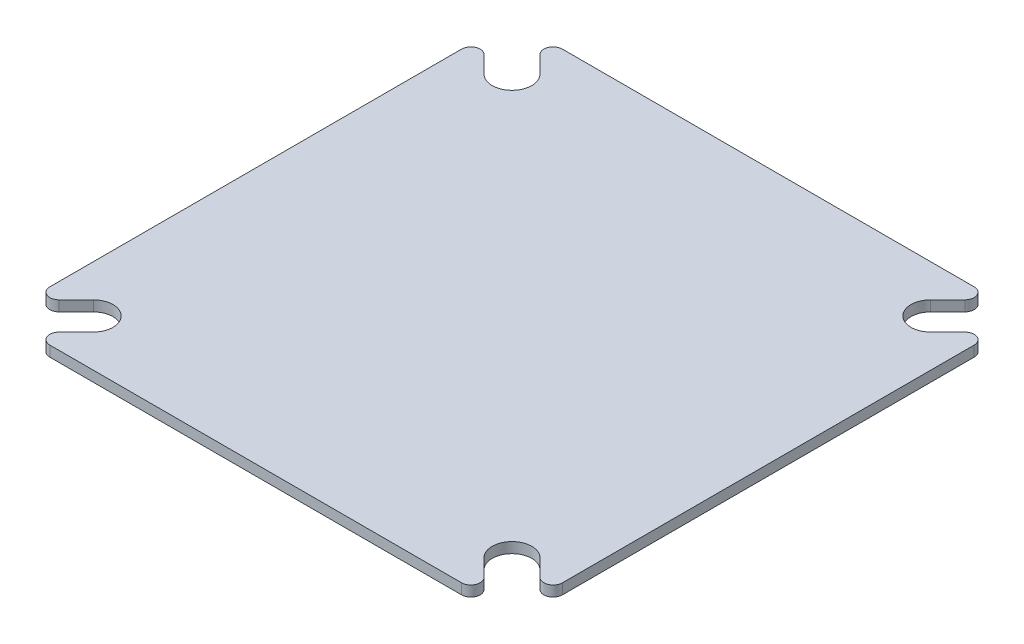
ISO-10303-21;
HEADER;
FILE_DESCRIPTION(('STEP AP214'),'2;1');
FILE_NAME('part.step','',(''),(''),'','','');
FILE_SCHEMA(('AUTOMOTIVE_DESIGN { 1 0 10303 214 1 1 1 1 }'));
ENDSEC;
DATA;
#1=APPLICATION_CONTEXT('core data for automotive mechanical design processes');
#2=APPLICATION_PROTOCOL_DEFINITION('international standard','automotive_design',2000,#1);
#3=PRODUCT_CONTEXT('',#1,'mechanical');
#4=PRODUCT('Part','Part','',(#3));
#5=PRODUCT_RELATED_PRODUCT_CATEGORY('part','',(#4));
#6=PRODUCT_DEFINITION_FORMATION('','',#4);
#7=PRODUCT_DEFINITION_CONTEXT('part definition',#1,'design');
#8=PRODUCT_DEFINITION('design','',#6,#7);
#9=PRODUCT_DEFINITION_SHAPE('','',#8);
#10=(LENGTH_UNIT() NAMED_UNIT(*) SI_UNIT(.MILLI.,.METRE.));
#11=(NAMED_UNIT(*) PLANE_ANGLE_UNIT() SI_UNIT($,.RADIAN.));
#12=(NAMED_UNIT(*) SI_UNIT($,.STERADIAN.) SOLID_ANGLE_UNIT());
#13=UNCERTAINTY_MEASURE_WITH_UNIT(LENGTH_MEASURE(1.E-05),#10,'distance_accuracy_value','');
#14=(GEOMETRIC_REPRESENTATION_CONTEXT(3) GLOBAL_UNCERTAINTY_ASSIGNED_CONTEXT((#13)) GLOBAL_UNIT_ASSIGNED_CONTEXT((#10,
#11,#12)) REPRESENTATION_CONTEXT('',''));
#15=CARTESIAN_POINT('',(0.,0.,0.));
#16=DIRECTION('',(0.,0.,1.));
#17=DIRECTION('',(1.,0.,0.));
#18=AXIS2_PLACEMENT_3D('',#15,#16,#17);
#19=CARTESIAN_POINT('',(-139.7,5.715,139.7));
#20=DIRECTION('',(1.,0.,0.));
#21=DIRECTION('',(0.,0.,-1.));
#22=AXIS2_PLACEMENT_3D('',#19,#20,#21);
#23=PLANE('',#22);
#24=DIRECTION('',(0.,0.,1.));
#25=VECTOR('',#24,1.);
#26=CARTESIAN_POINT('',(-139.7,0.,139.7));
#27=LINE('',#26,#25);
#28=CARTESIAN_POINT('',(-139.7,0.,-112.195795103145));
#29=VERTEX_POINT('',#28);
#30=CARTESIAN_POINT('',(-139.7,0.,112.195795103145));
#31=VERTEX_POINT('',#30);
#32=EDGE_CURVE('E291',#29,#31,#27,.T.);
#33=ORIENTED_EDGE('',*,*,#32,.T.);
#34=DIRECTION('',(0.,1.,0.));
#35=VECTOR('',#34,1.);
#36=CARTESIAN_POINT('',(-139.7,5.715,112.195795103145));
#37=LINE('',#36,#35);
#38=CARTESIAN_POINT('',(-139.7,5.715,112.195795103145));
#39=VERTEX_POINT('',#38);
#40=EDGE_CURVE('E368',#31,#39,#37,.T.);
#41=ORIENTED_EDGE('',*,*,#40,.T.);
#42=DIRECTION('',(0.,0.,1.));
#43=VECTOR('',#42,1.);
#44=CARTESIAN_POINT('',(-139.7,5.715,139.7));
#45=LINE('',#44,#43);
#46=CARTESIAN_POINT('',(-139.7,5.715,-112.195795103145));
#47=VERTEX_POINT('',#46);
#48=EDGE_CURVE('E294',#47,#39,#45,.T.);
#49=ORIENTED_EDGE('',*,*,#48,.F.);
#50=DIRECTION('',(0.,1.,0.));
#51=VECTOR('',#50,1.);
#52=CARTESIAN_POINT('',(-139.7,5.715,-112.195795103145));
#53=LINE('',#52,#51);
#54=EDGE_CURVE('E366',#47,#29,#53,.F.);
#55=ORIENTED_EDGE('',*,*,#54,.T.);
#56=EDGE_LOOP('',(#33,#41,#49,#55));
#57=FACE_BOUND('',#56,.T.);
#58=ADVANCED_FACE('F37',(#57),#23,.F.);
#59=CARTESIAN_POINT('',(139.7,5.715,139.7));
#60=DIRECTION('',(0.,0.,-1.));
#61=DIRECTION('',(-1.,0.,0.));
#62=AXIS2_PLACEMENT_3D('',#59,#60,#61);
#63=PLANE('',#62);
#64=DIRECTION('',(1.,0.,0.));
#65=VECTOR('',#64,1.);
#66=CARTESIAN_POINT('',(139.7,0.,139.7));
#67=LINE('',#66,#65);
#68=CARTESIAN_POINT('',(-112.195795103145,0.,139.7));
#69=VERTEX_POINT('',#68);
#70=CARTESIAN_POINT('',(112.195795103145,0.,139.7));
#71=VERTEX_POINT('',#70);
#72=EDGE_CURVE('E310',#69,#71,#67,.T.);
#73=ORIENTED_EDGE('',*,*,#72,.T.);
#74=DIRECTION('',(0.,1.,0.));
#75=VECTOR('',#74,1.);
#76=CARTESIAN_POINT('',(112.195795103145,5.715,139.7));
#77=LINE('',#76,#75);
#78=CARTESIAN_POINT('',(112.195795103145,5.715,139.7));
#79=VERTEX_POINT('',#78);
#80=EDGE_CURVE('E319',#71,#79,#77,.T.);
#81=ORIENTED_EDGE('',*,*,#80,.T.);
#82=DIRECTION('',(1.,0.,0.));
#83=VECTOR('',#82,1.);
#84=CARTESIAN_POINT('',(139.7,5.715,139.7));
#85=LINE('',#84,#83);
#86=CARTESIAN_POINT('',(-112.195795103145,5.715,139.7));
#87=VERTEX_POINT('',#86);
#88=EDGE_CURVE('E297',#87,#79,#85,.T.);
#89=ORIENTED_EDGE('',*,*,#88,.F.);
#90=DIRECTION('',(0.,1.,0.));
#91=VECTOR('',#90,1.);
#92=CARTESIAN_POINT('',(-112.195795103145,5.715,139.7));
#93=LINE('',#92,#91);
#94=EDGE_CURVE('E307',#87,#69,#93,.F.);
#95=ORIENTED_EDGE('',*,*,#94,.T.);
#96=EDGE_LOOP('',(#73,#81,#89,#95));
#97=FACE_BOUND('',#96,.T.);
#98=ADVANCED_FACE('F454',(#97),#63,.F.);
#99=CARTESIAN_POINT('',(139.7,5.715,139.7));
#100=DIRECTION('',(-1.,0.,0.));
#101=DIRECTION('',(0.,0.,1.));
#102=AXIS2_PLACEMENT_3D('',#99,#100,#101);
#103=PLANE('',#102);
#104=DIRECTION('',(0.,0.,-1.));
#105=VECTOR('',#104,1.);
#106=CARTESIAN_POINT('',(139.7,5.715,139.7));
#107=LINE('',#106,#105);
#108=CARTESIAN_POINT('',(139.7,5.715,112.195795103145));
#109=VERTEX_POINT('',#108);
#110=CARTESIAN_POINT('',(139.7,5.715,-112.195795103145));
#111=VERTEX_POINT('',#110);
#112=EDGE_CURVE('E301',#109,#111,#107,.T.);
#113=ORIENTED_EDGE('',*,*,#112,.F.);
#114=DIRECTION('',(0.,1.,0.));
#115=VECTOR('',#114,1.);
#116=CARTESIAN_POINT('',(139.7,5.715,112.195795103145));
#117=LINE('',#116,#115);
#118=CARTESIAN_POINT('',(139.7,0.,112.195795103145));
#119=VERTEX_POINT('',#118);
#120=EDGE_CURVE('E361',#109,#119,#117,.F.);
#121=ORIENTED_EDGE('',*,*,#120,.T.);
#122=DIRECTION('',(0.,0.,-1.));
#123=VECTOR('',#122,1.);
#124=CARTESIAN_POINT('',(139.7,0.,139.7));
#125=LINE('',#124,#123);
#126=CARTESIAN_POINT('',(139.7,0.,-112.195795103145));
#127=VERTEX_POINT('',#126);
#128=EDGE_CURVE('E313',#119,#127,#125,.T.);
#129=ORIENTED_EDGE('',*,*,#128,.T.);
#130=DIRECTION('',(0.,1.,0.));
#131=VECTOR('',#130,1.);
#132=CARTESIAN_POINT('',(139.7,5.715,-112.195795103145));
#133=LINE('',#132,#131);
#134=EDGE_CURVE('E358',#127,#111,#133,.T.);
#135=ORIENTED_EDGE('',*,*,#134,.T.);
#136=EDGE_LOOP('',(#113,#121,#129,#135));
#137=FACE_BOUND('',#136,.T.);
#138=ADVANCED_FACE('F431',(#137),#103,.F.);
#139=CARTESIAN_POINT('',(139.7,5.715,-139.7));
#140=DIRECTION('',(0.,0.,1.));
#141=DIRECTION('',(1.,0.,0.));
#142=AXIS2_PLACEMENT_3D('',#139,#140,#141);
#143=PLANE('',#142);
#144=DIRECTION('',(-1.,0.,0.));
#145=VECTOR('',#144,1.);
#146=CARTESIAN_POINT('',(139.7,5.715,-139.7));
#147=LINE('',#146,#145);
#148=CARTESIAN_POINT('',(112.195795103145,5.715,-139.7));
#149=VERTEX_POINT('',#148);
#150=CARTESIAN_POINT('',(-112.195795103145,5.715,-139.7));
#151=VERTEX_POINT('',#150);
#152=EDGE_CURVE('E304',#149,#151,#147,.T.);
#153=ORIENTED_EDGE('',*,*,#152,.F.);
#154=DIRECTION('',(0.,1.,0.));
#155=VECTOR('',#154,1.);
#156=CARTESIAN_POINT('',(112.195795103145,5.715,-139.7));
#157=LINE('',#156,#155);
#158=CARTESIAN_POINT('',(112.195795103145,0.,-139.7));
#159=VERTEX_POINT('',#158);
#160=EDGE_CURVE('E380',#149,#159,#157,.F.);
#161=ORIENTED_EDGE('',*,*,#160,.T.);
#162=DIRECTION('',(-1.,0.,0.));
#163=VECTOR('',#162,1.);
#164=CARTESIAN_POINT('',(139.7,0.,-139.7));
#165=LINE('',#164,#163);
#166=CARTESIAN_POINT('',(-112.195795103145,0.,-139.7));
#167=VERTEX_POINT('',#166);
#168=EDGE_CURVE('E298',#159,#167,#165,.T.);
#169=ORIENTED_EDGE('',*,*,#168,.T.);
#170=DIRECTION('',(0.,1.,0.));
#171=VECTOR('',#170,1.);
#172=CARTESIAN_POINT('',(-112.195795103145,5.715,-139.7));
#173=LINE('',#172,#171);
#174=EDGE_CURVE('E377',#167,#151,#173,.T.);
#175=ORIENTED_EDGE('',*,*,#174,.T.);
#176=EDGE_LOOP('',(#153,#161,#169,#175));
#177=FACE_BOUND('',#176,.T.);
#178=ADVANCED_FACE('F403',(#177),#143,.F.);
#179=CARTESIAN_POINT('',(0.,5.715,0.));
#180=DIRECTION('',(0.,1.,0.));
#181=DIRECTION('',(0.,0.,1.));
#182=AXIS2_PLACEMENT_3D('',#179,#180,#181);
#183=PLANE('',#182);
#184=ORIENTED_EDGE('',*,*,#88,.T.);
#185=CARTESIAN_POINT('',(112.195795103145,5.715,134.62));
#186=DIRECTION('',(0.,1.,0.));
#187=DIRECTION('',(0.,0.,1.));
#188=AXIS2_PLACEMENT_3D('',#185,#186,#187);
#189=CIRCLE('',#188,5.08);
#190=CARTESIAN_POINT('',(115.787897551572,5.715,131.027897551572));
#191=VERTEX_POINT('',#190);
#192=EDGE_CURVE('E336',#79,#191,#189,.T.);
#193=ORIENTED_EDGE('',*,*,#192,.T.);
#194=DIRECTION('',(0.707106781186548,0.,0.707106781186547));
#195=VECTOR('',#194,1.);
#196=CARTESIAN_POINT('',(124.46,5.715,139.7));
#197=LINE('',#196,#195);
#198=CARTESIAN_POINT('',(106.499487757862,5.715,121.739487757862));
#199=VERTEX_POINT('',#198);
#200=EDGE_CURVE('E247',#199,#191,#197,.T.);
#201=ORIENTED_EDGE('',*,*,#200,.F.);
#202=CARTESIAN_POINT('',(114.119487757862,5.715,114.119487757862));
#203=DIRECTION('',(0.,1.,0.));
#204=DIRECTION('',(0.,0.,1.));
#205=AXIS2_PLACEMENT_3D('',#202,#203,#204);
#206=CIRCLE('',#205,10.776307345283);
#207=CARTESIAN_POINT('',(121.739487757862,5.715,106.499487757862));
#208=VERTEX_POINT('',#207);
#209=EDGE_CURVE('E244',#208,#199,#206,.T.);
#210=ORIENTED_EDGE('',*,*,#209,.F.);
#211=DIRECTION('',(-0.707106781186548,0.,-0.707106781186547));
#212=VECTOR('',#211,1.);
#213=CARTESIAN_POINT('',(139.7,5.715,124.46));
#214=LINE('',#213,#212);
#215=CARTESIAN_POINT('',(131.027897551572,5.715,115.787897551572));
#216=VERTEX_POINT('',#215);
#217=EDGE_CURVE('E250',#216,#208,#214,.T.);
#218=ORIENTED_EDGE('',*,*,#217,.F.);
#219=CARTESIAN_POINT('',(134.62,5.715,112.195795103145));
#220=DIRECTION('',(0.,1.,0.));
#221=DIRECTION('',(0.,0.,1.));
#222=AXIS2_PLACEMENT_3D('',#219,#220,#221);
#223=CIRCLE('',#222,5.08);
#224=EDGE_CURVE('E334',#216,#109,#223,.T.);
#225=ORIENTED_EDGE('',*,*,#224,.T.);
#226=ORIENTED_EDGE('',*,*,#112,.T.);
#227=CARTESIAN_POINT('',(134.62,5.715,-112.195795103145));
#228=DIRECTION('',(0.,1.,0.));
#229=DIRECTION('',(0.,0.,1.));
#230=AXIS2_PLACEMENT_3D('',#227,#228,#229);
#231=CIRCLE('',#230,5.08);
#232=CARTESIAN_POINT('',(131.027897551572,5.715,-115.787897551572));
#233=VERTEX_POINT('',#232);
#234=EDGE_CURVE('E328',#111,#233,#231,.T.);
#235=ORIENTED_EDGE('',*,*,#234,.T.);
#236=DIRECTION('',(0.707106781186548,0.,-0.707106781186547));
#237=VECTOR('',#236,1.);
#238=CARTESIAN_POINT('',(139.7,5.715,-124.46));
#239=LINE('',#238,#237);
#240=CARTESIAN_POINT('',(121.739487757862,5.715,-106.499487757862));
#241=VERTEX_POINT('',#240);
#242=EDGE_CURVE('E265',#241,#233,#239,.T.);
#243=ORIENTED_EDGE('',*,*,#242,.F.);
#244=CARTESIAN_POINT('',(114.119487757862,5.715,-114.119487757862));
#245=DIRECTION('',(0.,1.,0.));
#246=DIRECTION('',(0.,0.,-1.));
#247=AXIS2_PLACEMENT_3D('',#244,#245,#246);
#248=CIRCLE('',#247,10.776307345283);
#249=CARTESIAN_POINT('',(106.499487757862,5.715,-121.739487757862));
#250=VERTEX_POINT('',#249);
#251=EDGE_CURVE('E262',#250,#241,#248,.T.);
#252=ORIENTED_EDGE('',*,*,#251,.F.);
#253=DIRECTION('',(-0.707106781186548,0.,0.707106781186547));
#254=VECTOR('',#253,1.);
#255=CARTESIAN_POINT('',(124.46,5.715,-139.7));
#256=LINE('',#255,#254);
#257=CARTESIAN_POINT('',(115.787897551572,5.715,-131.027897551572));
#258=VERTEX_POINT('',#257);
#259=EDGE_CURVE('E268',#258,#250,#256,.T.);
#260=ORIENTED_EDGE('',*,*,#259,.F.);
#261=CARTESIAN_POINT('',(112.195795103145,5.715,-134.62));
#262=DIRECTION('',(0.,1.,0.));
#263=DIRECTION('',(0.,0.,1.));
#264=AXIS2_PLACEMENT_3D('',#261,#262,#263);
#265=CIRCLE('',#264,5.08);
#266=EDGE_CURVE('E326',#258,#149,#265,.T.);
#267=ORIENTED_EDGE('',*,*,#266,.T.);
#268=ORIENTED_EDGE('',*,*,#152,.T.);
#269=CARTESIAN_POINT('',(-112.195795103145,5.715,-134.62));
#270=DIRECTION('',(0.,1.,0.));
#271=DIRECTION('',(0.,0.,1.));
#272=AXIS2_PLACEMENT_3D('',#269,#270,#271);
#273=CIRCLE('',#272,5.08);
#274=CARTESIAN_POINT('',(-115.787897551572,5.715,-131.027897551572));
#275=VERTEX_POINT('',#274);
#276=EDGE_CURVE('E322',#151,#275,#273,.T.);
#277=ORIENTED_EDGE('',*,*,#276,.T.);
#278=DIRECTION('',(-0.707106781186548,0.,-0.707106781186547));
#279=VECTOR('',#278,1.);
#280=CARTESIAN_POINT('',(-124.46,5.715,-139.7));
#281=LINE('',#280,#279);
#282=CARTESIAN_POINT('',(-106.499487757862,5.715,-121.739487757862));
#283=VERTEX_POINT('',#282);
#284=EDGE_CURVE('E286',#283,#275,#281,.T.);
#285=ORIENTED_EDGE('',*,*,#284,.F.);
#286=CARTESIAN_POINT('',(-114.119487757862,5.715,-114.119487757862));
#287=DIRECTION('',(0.,1.,0.));
#288=DIRECTION('',(0.,0.,1.));
#289=AXIS2_PLACEMENT_3D('',#286,#287,#288);
#290=CIRCLE('',#289,10.776307345283);
#291=CARTESIAN_POINT('',(-121.739487757862,5.715,-106.499487757862));
#292=VERTEX_POINT('',#291);
#293=EDGE_CURVE('E283',#292,#283,#290,.T.);
#294=ORIENTED_EDGE('',*,*,#293,.F.);
#295=DIRECTION('',(0.707106781186548,0.,0.707106781186547));
#296=VECTOR('',#295,1.);
#297=CARTESIAN_POINT('',(-139.7,5.715,-124.46));
#298=LINE('',#297,#296);
#299=CARTESIAN_POINT('',(-131.027897551572,5.715,-115.787897551572));
#300=VERTEX_POINT('',#299);
#301=EDGE_CURVE('E281',#300,#292,#298,.T.);
#302=ORIENTED_EDGE('',*,*,#301,.F.);
#303=CARTESIAN_POINT('',(-134.62,5.715,-112.195795103145));
#304=DIRECTION('',(0.,1.,0.));
#305=DIRECTION('',(0.,0.,1.));
#306=AXIS2_PLACEMENT_3D('',#303,#304,#305);
#307=CIRCLE('',#306,5.08);
#308=EDGE_CURVE('E324',#300,#47,#307,.T.);
#309=ORIENTED_EDGE('',*,*,#308,.T.);
#310=ORIENTED_EDGE('',*,*,#48,.T.);
#311=CARTESIAN_POINT('',(-134.62,5.715,112.195795103145));
#312=DIRECTION('',(0.,1.,0.));
#313=DIRECTION('',(0.,0.,1.));
#314=AXIS2_PLACEMENT_3D('',#311,#312,#313);
#315=CIRCLE('',#314,5.08);
#316=CARTESIAN_POINT('',(-131.027897551572,5.715,115.787897551572));
#317=VERTEX_POINT('',#316);
#318=EDGE_CURVE('E330',#39,#317,#315,.T.);
#319=ORIENTED_EDGE('',*,*,#318,.T.);
#320=DIRECTION('',(-0.707106781186548,0.,0.707106781186547));
#321=VECTOR('',#320,1.);
#322=CARTESIAN_POINT('',(-139.7,5.715,124.46));
#323=LINE('',#322,#321);
#324=CARTESIAN_POINT('',(-121.739487757862,5.715,106.499487757862));
#325=VERTEX_POINT('',#324);
#326=EDGE_CURVE('E233',#325,#317,#323,.T.);
#327=ORIENTED_EDGE('',*,*,#326,.F.);
#328=CARTESIAN_POINT('',(-114.119487757862,5.715,114.119487757862));
#329=DIRECTION('',(0.,1.,0.));
#330=DIRECTION('',(0.,0.,-1.));
#331=AXIS2_PLACEMENT_3D('',#328,#329,#330);
#332=CIRCLE('',#331,10.776307345283);
#333=CARTESIAN_POINT('',(-106.499487757862,5.715,121.739487757862));
#334=VERTEX_POINT('',#333);
#335=EDGE_CURVE('E218',#334,#325,#332,.T.);
#336=ORIENTED_EDGE('',*,*,#335,.F.);
#337=DIRECTION('',(0.707106781186548,0.,-0.707106781186547));
#338=VECTOR('',#337,1.);
#339=CARTESIAN_POINT('',(-124.46,5.715,139.7));
#340=LINE('',#339,#338);
#341=CARTESIAN_POINT('',(-115.787897551572,5.715,131.027897551572));
#342=VERTEX_POINT('',#341);
#343=EDGE_CURVE('E220',#342,#334,#340,.T.);
#344=ORIENTED_EDGE('',*,*,#343,.F.);
#345=CARTESIAN_POINT('',(-112.195795103145,5.715,134.62));
#346=DIRECTION('',(0.,1.,0.));
#347=DIRECTION('',(0.,0.,1.));
#348=AXIS2_PLACEMENT_3D('',#345,#346,#347);
#349=CIRCLE('',#348,5.08);
#350=EDGE_CURVE('E332',#342,#87,#349,.T.);
#351=ORIENTED_EDGE('',*,*,#350,.T.);
#352=EDGE_LOOP('',(#184,#193,#201,#210,#218,#225,#226,#235,#243,#252,#260,#267,#268,#277,#285,
#294,#302,#309,#310,#319,#327,#336,#344,#351));
#353=FACE_BOUND('',#352,.T.);
#354=ADVANCED_FACE('F390',(#353),#183,.T.);
#355=CARTESIAN_POINT('',(0.,0.,0.));
#356=DIRECTION('',(0.,1.,0.));
#357=DIRECTION('',(0.,0.,1.));
#358=AXIS2_PLACEMENT_3D('',#355,#356,#357);
#359=PLANE('',#358);
#360=DIRECTION('',(-0.707106781186548,0.,-0.707106781186547));
#361=VECTOR('',#360,1.);
#362=CARTESIAN_POINT('',(124.46,0.,139.7));
#363=LINE('',#362,#361);
#364=CARTESIAN_POINT('',(115.787897551572,0.,131.027897551572));
#365=VERTEX_POINT('',#364);
#366=CARTESIAN_POINT('',(106.499487757862,0.,121.739487757862));
#367=VERTEX_POINT('',#366);
#368=EDGE_CURVE('E226',#365,#367,#363,.T.);
#369=ORIENTED_EDGE('',*,*,#368,.F.);
#370=CARTESIAN_POINT('',(112.195795103145,0.,134.62));
#371=DIRECTION('',(0.,1.,0.));
#372=DIRECTION('',(0.,0.,1.));
#373=AXIS2_PLACEMENT_3D('',#370,#371,#372);
#374=CIRCLE('',#373,5.08);
#375=EDGE_CURVE('E353',#365,#71,#374,.F.);
#376=ORIENTED_EDGE('',*,*,#375,.T.);
#377=ORIENTED_EDGE('',*,*,#72,.F.);
#378=CARTESIAN_POINT('',(-112.195795103145,0.,134.62));
#379=DIRECTION('',(0.,1.,0.));
#380=DIRECTION('',(0.,0.,1.));
#381=AXIS2_PLACEMENT_3D('',#378,#379,#380);
#382=CIRCLE('',#381,5.08);
#383=CARTESIAN_POINT('',(-115.787897551572,0.,131.027897551572));
#384=VERTEX_POINT('',#383);
#385=EDGE_CURVE('E349',#69,#384,#382,.F.);
#386=ORIENTED_EDGE('',*,*,#385,.T.);
#387=DIRECTION('',(-0.707106781186548,0.,0.707106781186547));
#388=VECTOR('',#387,1.);
#389=CARTESIAN_POINT('',(-124.46,0.,139.7));
#390=LINE('',#389,#388);
#391=CARTESIAN_POINT('',(-106.499487757862,0.,121.739487757862));
#392=VERTEX_POINT('',#391);
#393=EDGE_CURVE('E225',#392,#384,#390,.T.);
#394=ORIENTED_EDGE('',*,*,#393,.F.);
#395=CARTESIAN_POINT('',(-114.119487757862,0.,114.119487757862));
#396=DIRECTION('',(0.,1.,0.));
#397=DIRECTION('',(0.,0.,1.));
#398=AXIS2_PLACEMENT_3D('',#395,#396,#397);
#399=CIRCLE('',#398,10.776307345283);
#400=CARTESIAN_POINT('',(-121.739487757862,0.,106.499487757862));
#401=VERTEX_POINT('',#400);
#402=EDGE_CURVE('E215',#401,#392,#399,.F.);
#403=ORIENTED_EDGE('',*,*,#402,.F.);
#404=DIRECTION('',(0.707106781186548,0.,-0.707106781186547));
#405=VECTOR('',#404,1.);
#406=CARTESIAN_POINT('',(-139.7,0.,124.46));
#407=LINE('',#406,#405);
#408=CARTESIAN_POINT('',(-131.027897551572,0.,115.787897551572));
#409=VERTEX_POINT('',#408);
#410=EDGE_CURVE('E198',#409,#401,#407,.T.);
#411=ORIENTED_EDGE('',*,*,#410,.F.);
#412=CARTESIAN_POINT('',(-134.62,0.,112.195795103145));
#413=DIRECTION('',(0.,1.,0.));
#414=DIRECTION('',(0.,0.,1.));
#415=AXIS2_PLACEMENT_3D('',#412,#413,#414);
#416=CIRCLE('',#415,5.08);
#417=EDGE_CURVE('E347',#409,#31,#416,.F.);
#418=ORIENTED_EDGE('',*,*,#417,.T.);
#419=ORIENTED_EDGE('',*,*,#32,.F.);
#420=CARTESIAN_POINT('',(-134.62,0.,-112.195795103145));
#421=DIRECTION('',(0.,1.,0.));
#422=DIRECTION('',(0.,0.,1.));
#423=AXIS2_PLACEMENT_3D('',#420,#421,#422);
#424=CIRCLE('',#423,5.08);
#425=CARTESIAN_POINT('',(-131.027897551572,0.,-115.787897551572));
#426=VERTEX_POINT('',#425);
#427=EDGE_CURVE('E58',#29,#426,#424,.F.);
#428=ORIENTED_EDGE('',*,*,#427,.T.);
#429=DIRECTION('',(-0.707106781186548,0.,-0.707106781186547));
#430=VECTOR('',#429,1.);
#431=CARTESIAN_POINT('',(-139.7,0.,-124.46));
#432=LINE('',#431,#430);
#433=CARTESIAN_POINT('',(-121.739487757862,0.,-106.499487757862));
#434=VERTEX_POINT('',#433);
#435=EDGE_CURVE('E208',#434,#426,#432,.T.);
#436=ORIENTED_EDGE('',*,*,#435,.F.);
#437=CARTESIAN_POINT('',(-114.119487757862,0.,-114.119487757862));
#438=DIRECTION('',(0.,1.,0.));
#439=DIRECTION('',(0.,0.,1.));
#440=AXIS2_PLACEMENT_3D('',#437,#438,#439);
#441=CIRCLE('',#440,10.776307345283);
#442=CARTESIAN_POINT('',(-106.499487757862,0.,-121.739487757862));
#443=VERTEX_POINT('',#442);
#444=EDGE_CURVE('E277',#443,#434,#441,.F.);
#445=ORIENTED_EDGE('',*,*,#444,.F.);
#446=DIRECTION('',(0.707106781186548,0.,0.707106781186547));
#447=VECTOR('',#446,1.);
#448=CARTESIAN_POINT('',(-124.46,0.,-139.7));
#449=LINE('',#448,#447);
#450=CARTESIAN_POINT('',(-115.787897551572,0.,-131.027897551572));
#451=VERTEX_POINT('',#450);
#452=EDGE_CURVE('E279',#451,#443,#449,.T.);
#453=ORIENTED_EDGE('',*,*,#452,.F.);
#454=CARTESIAN_POINT('',(-112.195795103145,0.,-134.62));
#455=DIRECTION('',(0.,1.,0.));
#456=DIRECTION('',(0.,0.,1.));
#457=AXIS2_PLACEMENT_3D('',#454,#455,#456);
#458=CIRCLE('',#457,5.08);
#459=EDGE_CURVE('E340',#451,#167,#458,.F.);
#460=ORIENTED_EDGE('',*,*,#459,.T.);
#461=ORIENTED_EDGE('',*,*,#168,.F.);
#462=CARTESIAN_POINT('',(112.195795103145,0.,-134.62));
#463=DIRECTION('',(0.,1.,0.));
#464=DIRECTION('',(0.,0.,1.));
#465=AXIS2_PLACEMENT_3D('',#462,#463,#464);
#466=CIRCLE('',#465,5.08);
#467=CARTESIAN_POINT('',(115.787897551572,0.,-131.027897551572));
#468=VERTEX_POINT('',#467);
#469=EDGE_CURVE('E343',#159,#468,#466,.F.);
#470=ORIENTED_EDGE('',*,*,#469,.T.);
#471=DIRECTION('',(0.707106781186548,0.,-0.707106781186547));
#472=VECTOR('',#471,1.);
#473=CARTESIAN_POINT('',(124.46,0.,-139.7));
#474=LINE('',#473,#472);
#475=CARTESIAN_POINT('',(106.499487757862,0.,-121.739487757862));
#476=VERTEX_POINT('',#475);
#477=EDGE_CURVE('E259',#476,#468,#474,.T.);
#478=ORIENTED_EDGE('',*,*,#477,.F.);
#479=CARTESIAN_POINT('',(114.119487757862,0.,-114.119487757862));
#480=DIRECTION('',(0.,1.,0.));
#481=DIRECTION('',(0.,0.,1.));
#482=AXIS2_PLACEMENT_3D('',#479,#480,#481);
#483=CIRCLE('',#482,10.776307345283);
#484=CARTESIAN_POINT('',(121.739487757862,0.,-106.499487757862));
#485=VERTEX_POINT('',#484);
#486=EDGE_CURVE('E256',#485,#476,#483,.F.);
#487=ORIENTED_EDGE('',*,*,#486,.F.);
#488=DIRECTION('',(-0.707106781186548,0.,0.707106781186547));
#489=VECTOR('',#488,1.);
#490=CARTESIAN_POINT('',(139.7,0.,-124.46));
#491=LINE('',#490,#489);
#492=CARTESIAN_POINT('',(131.027897551572,0.,-115.787897551572));
#493=VERTEX_POINT('',#492);
#494=EDGE_CURVE('E241',#493,#485,#491,.T.);
#495=ORIENTED_EDGE('',*,*,#494,.F.);
#496=CARTESIAN_POINT('',(134.62,0.,-112.195795103145));
#497=DIRECTION('',(0.,1.,0.));
#498=DIRECTION('',(0.,0.,1.));
#499=AXIS2_PLACEMENT_3D('',#496,#497,#498);
#500=CIRCLE('',#499,5.08);
#501=EDGE_CURVE('E345',#493,#127,#500,.F.);
#502=ORIENTED_EDGE('',*,*,#501,.T.);
#503=ORIENTED_EDGE('',*,*,#128,.F.);
#504=CARTESIAN_POINT('',(134.62,0.,112.195795103145));
#505=DIRECTION('',(0.,1.,0.));
#506=DIRECTION('',(0.,0.,1.));
#507=AXIS2_PLACEMENT_3D('',#504,#505,#506);
#508=CIRCLE('',#507,5.08);
#509=CARTESIAN_POINT('',(131.027897551572,0.,115.787897551572));
#510=VERTEX_POINT('',#509);
#511=EDGE_CURVE('E351',#119,#510,#508,.F.);
#512=ORIENTED_EDGE('',*,*,#511,.T.);
#513=DIRECTION('',(0.707106781186548,0.,0.707106781186547));
#514=VECTOR('',#513,1.);
#515=CARTESIAN_POINT('',(139.7,0.,124.46));
#516=LINE('',#515,#514);
#517=CARTESIAN_POINT('',(121.739487757862,0.,106.499487757862));
#518=VERTEX_POINT('',#517);
#519=EDGE_CURVE('E240',#518,#510,#516,.T.);
#520=ORIENTED_EDGE('',*,*,#519,.F.);
#521=CARTESIAN_POINT('',(114.119487757862,0.,114.119487757862));
#522=DIRECTION('',(0.,1.,0.));
#523=DIRECTION('',(0.,0.,1.));
#524=AXIS2_PLACEMENT_3D('',#521,#522,#523);
#525=CIRCLE('',#524,10.776307345283);
#526=EDGE_CURVE('E237',#367,#518,#525,.F.);
#527=ORIENTED_EDGE('',*,*,#526,.F.);
#528=EDGE_LOOP('',(#369,#376,#377,#386,#394,#403,#411,#418,#419,#428,#436,#445,#453,#460,#461,
#470,#478,#487,#495,#502,#503,#512,#520,#527));
#529=FACE_BOUND('',#528,.T.);
#530=ADVANCED_FACE('F223',(#529),#359,.F.);
#531=CARTESIAN_POINT('',(-124.46,-0.00100000000000013,-139.7));
#532=DIRECTION('',(0.707106781186547,0.,-0.707106781186548));
#533=DIRECTION('',(-0.707106781186548,0.,-0.707106781186547));
#534=AXIS2_PLACEMENT_3D('',#531,#532,#533);
#535=PLANE('',#534);
#536=ORIENTED_EDGE('',*,*,#284,.T.);
#537=DIRECTION('',(0.,1.,0.));
#538=VECTOR('',#537,1.);
#539=CARTESIAN_POINT('',(-115.787897551572,-0.00100000000000013,-131.027897551572));
#540=LINE('',#539,#538);
#541=EDGE_CURVE('E11',#275,#451,#540,.F.);
#542=ORIENTED_EDGE('',*,*,#541,.T.);
#543=ORIENTED_EDGE('',*,*,#452,.T.);
#544=DIRECTION('',(0.,1.,0.));
#545=VECTOR('',#544,1.);
#546=CARTESIAN_POINT('',(-106.499487757862,-0.00100000000000013,-121.739487757862));
#547=LINE('',#546,#545);
#548=EDGE_CURVE('E289',#443,#283,#547,.T.);
#549=ORIENTED_EDGE('',*,*,#548,.T.);
#550=EDGE_LOOP('',(#536,#542,#543,#549));
#551=FACE_BOUND('',#550,.T.);
#552=ADVANCED_FACE('F614',(#551),#535,.F.);
#553=CARTESIAN_POINT('',(-114.119487757862,-0.00100000000000013,-114.119487757862));
#554=DIRECTION('',(0.,1.,0.));
#555=DIRECTION('',(0.,0.,1.));
#556=AXIS2_PLACEMENT_3D('',#553,#554,#555);
#557=CYLINDRICAL_SURFACE('',#556,10.776307345283);
#558=ORIENTED_EDGE('',*,*,#444,.T.);
#559=DIRECTION('',(0.,1.,0.));
#560=VECTOR('',#559,1.);
#561=CARTESIAN_POINT('',(-121.739487757862,-0.00100000000000013,-106.499487757862));
#562=LINE('',#561,#560);
#563=EDGE_CURVE('E288',#434,#292,#562,.T.);
#564=ORIENTED_EDGE('',*,*,#563,.T.);
#565=ORIENTED_EDGE('',*,*,#293,.T.);
#566=ORIENTED_EDGE('',*,*,#548,.F.);
#567=EDGE_LOOP('',(#558,#564,#565,#566));
#568=FACE_BOUND('',#567,.T.);
#569=ADVANCED_FACE('F395',(#568),#557,.F.);
#570=CARTESIAN_POINT('',(-139.7,-0.00100000000000013,-124.46));
#571=DIRECTION('',(-0.707106781186547,0.,0.707106781186548));
#572=DIRECTION('',(0.707106781186548,0.,0.707106781186547));
#573=AXIS2_PLACEMENT_3D('',#570,#571,#572);
#574=PLANE('',#573);
#575=ORIENTED_EDGE('',*,*,#435,.T.);
#576=DIRECTION('',(0.,1.,0.));
#577=VECTOR('',#576,1.);
#578=CARTESIAN_POINT('',(-131.027897551572,-0.00100000000000013,-115.787897551572));
#579=LINE('',#578,#577);
#580=EDGE_CURVE('E45',#426,#300,#579,.T.);
#581=ORIENTED_EDGE('',*,*,#580,.T.);
#582=ORIENTED_EDGE('',*,*,#301,.T.);
#583=ORIENTED_EDGE('',*,*,#563,.F.);
#584=EDGE_LOOP('',(#575,#581,#582,#583));
#585=FACE_BOUND('',#584,.T.);
#586=ADVANCED_FACE('F385',(#585),#574,.F.);
#587=CARTESIAN_POINT('',(-114.119487757862,-0.00100000000000013,114.119487757862));
#588=DIRECTION('',(0.,1.,0.));
#589=DIRECTION('',(0.,0.,1.));
#590=AXIS2_PLACEMENT_3D('',#587,#588,#589);
#591=CYLINDRICAL_SURFACE('',#590,10.776307345283);
#592=ORIENTED_EDGE('',*,*,#402,.T.);
#593=DIRECTION('',(0.,1.,0.));
#594=VECTOR('',#593,1.);
#595=CARTESIAN_POINT('',(-106.499487757862,-0.00100000000000013,121.739487757862));
#596=LINE('',#595,#594);
#597=EDGE_CURVE('E209',#392,#334,#596,.T.);
#598=ORIENTED_EDGE('',*,*,#597,.T.);
#599=ORIENTED_EDGE('',*,*,#335,.T.);
#600=DIRECTION('',(0.,1.,0.));
#601=VECTOR('',#600,1.);
#602=CARTESIAN_POINT('',(-121.739487757862,-0.00100000000000013,106.499487757862));
#603=LINE('',#602,#601);
#604=EDGE_CURVE('E202',#401,#325,#603,.T.);
#605=ORIENTED_EDGE('',*,*,#604,.F.);
#606=EDGE_LOOP('',(#592,#598,#599,#605));
#607=FACE_BOUND('',#606,.T.);
#608=ADVANCED_FACE('F213',(#607),#591,.F.);
#609=CARTESIAN_POINT('',(-124.46,-0.00100000000000013,139.7));
#610=DIRECTION('',(0.707106781186547,0.,0.707106781186548));
#611=DIRECTION('',(0.707106781186548,0.,-0.707106781186547));
#612=AXIS2_PLACEMENT_3D('',#609,#610,#611);
#613=PLANE('',#612);
#614=ORIENTED_EDGE('',*,*,#393,.T.);
#615=DIRECTION('',(0.,1.,0.));
#616=VECTOR('',#615,1.);
#617=CARTESIAN_POINT('',(-115.787897551572,-0.00100000000000013,131.027897551572));
#618=LINE('',#617,#616);
#619=EDGE_CURVE('E363',#384,#342,#618,.T.);
#620=ORIENTED_EDGE('',*,*,#619,.T.);
#621=ORIENTED_EDGE('',*,*,#343,.T.);
#622=ORIENTED_EDGE('',*,*,#597,.F.);
#623=EDGE_LOOP('',(#614,#620,#621,#622));
#624=FACE_BOUND('',#623,.T.);
#625=ADVANCED_FACE('F463',(#624),#613,.F.);
#626=CARTESIAN_POINT('',(-139.7,-0.00100000000000013,124.46));
#627=DIRECTION('',(-0.707106781186547,0.,-0.707106781186548));
#628=DIRECTION('',(-0.707106781186548,0.,0.707106781186547));
#629=AXIS2_PLACEMENT_3D('',#626,#627,#628);
#630=PLANE('',#629);
#631=ORIENTED_EDGE('',*,*,#326,.T.);
#632=DIRECTION('',(0.,1.,0.));
#633=VECTOR('',#632,1.);
#634=CARTESIAN_POINT('',(-131.027897551572,-0.00100000000000013,115.787897551572));
#635=LINE('',#634,#633);
#636=EDGE_CURVE('E205',#317,#409,#635,.F.);
#637=ORIENTED_EDGE('',*,*,#636,.T.);
#638=ORIENTED_EDGE('',*,*,#410,.T.);
#639=ORIENTED_EDGE('',*,*,#604,.T.);
#640=EDGE_LOOP('',(#631,#637,#638,#639));
#641=FACE_BOUND('',#640,.T.);
#642=ADVANCED_FACE('F201',(#641),#630,.F.);
#643=CARTESIAN_POINT('',(114.119487757862,-0.00100000000000013,114.119487757862));
#644=DIRECTION('',(0.,1.,0.));
#645=DIRECTION('',(0.,0.,1.));
#646=AXIS2_PLACEMENT_3D('',#643,#644,#645);
#647=CYLINDRICAL_SURFACE('',#646,10.776307345283);
#648=ORIENTED_EDGE('',*,*,#526,.T.);
#649=DIRECTION('',(0.,1.,0.));
#650=VECTOR('',#649,1.);
#651=CARTESIAN_POINT('',(121.739487757862,-0.00100000000000013,106.499487757862));
#652=LINE('',#651,#650);
#653=EDGE_CURVE('E229',#518,#208,#652,.T.);
#654=ORIENTED_EDGE('',*,*,#653,.T.);
#655=ORIENTED_EDGE('',*,*,#209,.T.);
#656=DIRECTION('',(0.,1.,0.));
#657=VECTOR('',#656,1.);
#658=CARTESIAN_POINT('',(106.499487757862,-0.00100000000000013,121.739487757862));
#659=LINE('',#658,#657);
#660=EDGE_CURVE('E252',#367,#199,#659,.T.);
#661=ORIENTED_EDGE('',*,*,#660,.F.);
#662=EDGE_LOOP('',(#648,#654,#655,#661));
#663=FACE_BOUND('',#662,.T.);
#664=ADVANCED_FACE('F444',(#663),#647,.F.);
#665=CARTESIAN_POINT('',(139.7,-0.00100000000000013,124.46));
#666=DIRECTION('',(0.707106781186547,0.,-0.707106781186548));
#667=DIRECTION('',(-0.707106781186548,0.,-0.707106781186547));
#668=AXIS2_PLACEMENT_3D('',#665,#666,#667);
#669=PLANE('',#668);
#670=ORIENTED_EDGE('',*,*,#519,.T.);
#671=DIRECTION('',(0.,1.,0.));
#672=VECTOR('',#671,1.);
#673=CARTESIAN_POINT('',(131.027897551572,-0.00100000000000013,115.787897551572));
#674=LINE('',#673,#672);
#675=EDGE_CURVE('E355',#510,#216,#674,.T.);
#676=ORIENTED_EDGE('',*,*,#675,.T.);
#677=ORIENTED_EDGE('',*,*,#217,.T.);
#678=ORIENTED_EDGE('',*,*,#653,.F.);
#679=EDGE_LOOP('',(#670,#676,#677,#678));
#680=FACE_BOUND('',#679,.T.);
#681=ADVANCED_FACE('F439',(#680),#669,.F.);
#682=CARTESIAN_POINT('',(124.46,-0.00100000000000013,139.7));
#683=DIRECTION('',(-0.707106781186547,0.,0.707106781186548));
#684=DIRECTION('',(0.707106781186548,0.,0.707106781186547));
#685=AXIS2_PLACEMENT_3D('',#682,#683,#684);
#686=PLANE('',#685);
#687=ORIENTED_EDGE('',*,*,#200,.T.);
#688=DIRECTION('',(0.,1.,0.));
#689=VECTOR('',#688,1.);
#690=CARTESIAN_POINT('',(115.787897551572,-0.00100000000000013,131.027897551572));
#691=LINE('',#690,#689);
#692=EDGE_CURVE('E338',#191,#365,#691,.F.);
#693=ORIENTED_EDGE('',*,*,#692,.T.);
#694=ORIENTED_EDGE('',*,*,#368,.T.);
#695=ORIENTED_EDGE('',*,*,#660,.T.);
#696=EDGE_LOOP('',(#687,#693,#694,#695));
#697=FACE_BOUND('',#696,.T.);
#698=ADVANCED_FACE('F557',(#697),#686,.F.);
#699=CARTESIAN_POINT('',(114.119487757862,-0.00100000000000013,-114.119487757862));
#700=DIRECTION('',(0.,1.,0.));
#701=DIRECTION('',(0.,0.,1.));
#702=AXIS2_PLACEMENT_3D('',#699,#700,#701);
#703=CYLINDRICAL_SURFACE('',#702,10.776307345283);
#704=ORIENTED_EDGE('',*,*,#486,.T.);
#705=DIRECTION('',(0.,1.,0.));
#706=VECTOR('',#705,1.);
#707=CARTESIAN_POINT('',(106.499487757862,-0.00100000000000013,-121.739487757862));
#708=LINE('',#707,#706);
#709=EDGE_CURVE('E271',#476,#250,#708,.T.);
#710=ORIENTED_EDGE('',*,*,#709,.T.);
#711=ORIENTED_EDGE('',*,*,#251,.T.);
#712=DIRECTION('',(0.,1.,0.));
#713=VECTOR('',#712,1.);
#714=CARTESIAN_POINT('',(121.739487757862,-0.00100000000000013,-106.499487757862));
#715=LINE('',#714,#713);
#716=EDGE_CURVE('E270',#485,#241,#715,.T.);
#717=ORIENTED_EDGE('',*,*,#716,.F.);
#718=EDGE_LOOP('',(#704,#710,#711,#717));
#719=FACE_BOUND('',#718,.T.);
#720=ADVANCED_FACE('F419',(#719),#703,.F.);
#721=CARTESIAN_POINT('',(124.46,-0.00100000000000013,-139.7));
#722=DIRECTION('',(-0.707106781186547,0.,-0.707106781186548));
#723=DIRECTION('',(-0.707106781186548,0.,0.707106781186547));
#724=AXIS2_PLACEMENT_3D('',#721,#722,#723);
#725=PLANE('',#724);
#726=ORIENTED_EDGE('',*,*,#477,.T.);
#727=DIRECTION('',(0.,1.,0.));
#728=VECTOR('',#727,1.);
#729=CARTESIAN_POINT('',(115.787897551572,-0.00100000000000013,-131.027897551572));
#730=LINE('',#729,#728);
#731=EDGE_CURVE('E374',#468,#258,#730,.T.);
#732=ORIENTED_EDGE('',*,*,#731,.T.);
#733=ORIENTED_EDGE('',*,*,#259,.T.);
#734=ORIENTED_EDGE('',*,*,#709,.F.);
#735=EDGE_LOOP('',(#726,#732,#733,#734));
#736=FACE_BOUND('',#735,.T.);
#737=ADVANCED_FACE('F412',(#736),#725,.F.);
#738=CARTESIAN_POINT('',(139.7,-0.00100000000000013,-124.46));
#739=DIRECTION('',(0.707106781186547,0.,0.707106781186548));
#740=DIRECTION('',(0.707106781186548,0.,-0.707106781186547));
#741=AXIS2_PLACEMENT_3D('',#738,#739,#740);
#742=PLANE('',#741);
#743=ORIENTED_EDGE('',*,*,#242,.T.);
#744=DIRECTION('',(0.,1.,0.));
#745=VECTOR('',#744,1.);
#746=CARTESIAN_POINT('',(131.027897551572,-0.00100000000000013,-115.787897551572));
#747=LINE('',#746,#745);
#748=EDGE_CURVE('E372',#233,#493,#747,.F.);
#749=ORIENTED_EDGE('',*,*,#748,.T.);
#750=ORIENTED_EDGE('',*,*,#494,.T.);
#751=ORIENTED_EDGE('',*,*,#716,.T.);
#752=EDGE_LOOP('',(#743,#749,#750,#751));
#753=FACE_BOUND('',#752,.T.);
#754=ADVANCED_FACE('F422',(#753),#742,.F.);
#755=CARTESIAN_POINT('',(112.195795103145,5.715,134.62));
#756=DIRECTION('',(0.,1.,0.));
#757=DIRECTION('',(0.,0.,1.));
#758=AXIS2_PLACEMENT_3D('',#755,#756,#757);
#759=CYLINDRICAL_SURFACE('',#758,5.08);
#760=ORIENTED_EDGE('',*,*,#375,.F.);
#761=ORIENTED_EDGE('',*,*,#692,.F.);
#762=ORIENTED_EDGE('',*,*,#192,.F.);
#763=ORIENTED_EDGE('',*,*,#80,.F.);
#764=EDGE_LOOP('',(#760,#761,#762,#763));
#765=FACE_BOUND('',#764,.T.);
#766=ADVANCED_FACE('F451',(#765),#759,.T.);
#767=CARTESIAN_POINT('',(134.62,-0.00100000000000013,112.195795103145));
#768=DIRECTION('',(0.,1.,0.));
#769=DIRECTION('',(0.,0.,1.));
#770=AXIS2_PLACEMENT_3D('',#767,#768,#769);
#771=CYLINDRICAL_SURFACE('',#770,5.08);
#772=ORIENTED_EDGE('',*,*,#511,.F.);
#773=ORIENTED_EDGE('',*,*,#120,.F.);
#774=ORIENTED_EDGE('',*,*,#224,.F.);
#775=ORIENTED_EDGE('',*,*,#675,.F.);
#776=EDGE_LOOP('',(#772,#773,#774,#775));
#777=FACE_BOUND('',#776,.T.);
#778=ADVANCED_FACE('F434',(#777),#771,.T.);
#779=CARTESIAN_POINT('',(-112.195795103145,-0.00100000000000013,134.62));
#780=DIRECTION('',(0.,1.,0.));
#781=DIRECTION('',(0.,0.,1.));
#782=AXIS2_PLACEMENT_3D('',#779,#780,#781);
#783=CYLINDRICAL_SURFACE('',#782,5.08);
#784=ORIENTED_EDGE('',*,*,#385,.F.);
#785=ORIENTED_EDGE('',*,*,#94,.F.);
#786=ORIENTED_EDGE('',*,*,#350,.F.);
#787=ORIENTED_EDGE('',*,*,#619,.F.);
#788=EDGE_LOOP('',(#784,#785,#786,#787));
#789=FACE_BOUND('',#788,.T.);
#790=ADVANCED_FACE('F461',(#789),#783,.T.);
#791=CARTESIAN_POINT('',(-134.62,5.715,112.195795103145));
#792=DIRECTION('',(0.,1.,0.));
#793=DIRECTION('',(0.,0.,1.));
#794=AXIS2_PLACEMENT_3D('',#791,#792,#793);
#795=CYLINDRICAL_SURFACE('',#794,5.08);
#796=ORIENTED_EDGE('',*,*,#417,.F.);
#797=ORIENTED_EDGE('',*,*,#636,.F.);
#798=ORIENTED_EDGE('',*,*,#318,.F.);
#799=ORIENTED_EDGE('',*,*,#40,.F.);
#800=EDGE_LOOP('',(#796,#797,#798,#799));
#801=FACE_BOUND('',#800,.T.);
#802=ADVANCED_FACE('F465',(#801),#795,.T.);
#803=CARTESIAN_POINT('',(134.62,5.715,-112.195795103145));
#804=DIRECTION('',(0.,1.,0.));
#805=DIRECTION('',(0.,0.,1.));
#806=AXIS2_PLACEMENT_3D('',#803,#804,#805);
#807=CYLINDRICAL_SURFACE('',#806,5.08);
#808=ORIENTED_EDGE('',*,*,#501,.F.);
#809=ORIENTED_EDGE('',*,*,#748,.F.);
#810=ORIENTED_EDGE('',*,*,#234,.F.);
#811=ORIENTED_EDGE('',*,*,#134,.F.);
#812=EDGE_LOOP('',(#808,#809,#810,#811));
#813=FACE_BOUND('',#812,.T.);
#814=ADVANCED_FACE('F425',(#813),#807,.T.);
#815=CARTESIAN_POINT('',(112.195795103145,-0.00100000000000013,-134.62));
#816=DIRECTION('',(0.,1.,0.));
#817=DIRECTION('',(0.,0.,1.));
#818=AXIS2_PLACEMENT_3D('',#815,#816,#817);
#819=CYLINDRICAL_SURFACE('',#818,5.08);
#820=ORIENTED_EDGE('',*,*,#469,.F.);
#821=ORIENTED_EDGE('',*,*,#160,.F.);
#822=ORIENTED_EDGE('',*,*,#266,.F.);
#823=ORIENTED_EDGE('',*,*,#731,.F.);
#824=EDGE_LOOP('',(#820,#821,#822,#823));
#825=FACE_BOUND('',#824,.T.);
#826=ADVANCED_FACE('F410',(#825),#819,.T.);
#827=CARTESIAN_POINT('',(-134.62,-0.00100000000000013,-112.195795103145));
#828=DIRECTION('',(0.,1.,0.));
#829=DIRECTION('',(0.,0.,1.));
#830=AXIS2_PLACEMENT_3D('',#827,#828,#829);
#831=CYLINDRICAL_SURFACE('',#830,5.08);
#832=ORIENTED_EDGE('',*,*,#427,.F.);
#833=ORIENTED_EDGE('',*,*,#54,.F.);
#834=ORIENTED_EDGE('',*,*,#308,.F.);
#835=ORIENTED_EDGE('',*,*,#580,.F.);
#836=EDGE_LOOP('',(#832,#833,#834,#835));
#837=FACE_BOUND('',#836,.T.);
#838=ADVANCED_FACE('F469',(#837),#831,.T.);
#839=CARTESIAN_POINT('',(-112.195795103145,5.715,-134.62));
#840=DIRECTION('',(0.,1.,0.));
#841=DIRECTION('',(0.,0.,1.));
#842=AXIS2_PLACEMENT_3D('',#839,#840,#841);
#843=CYLINDRICAL_SURFACE('',#842,5.08);
#844=ORIENTED_EDGE('',*,*,#459,.F.);
#845=ORIENTED_EDGE('',*,*,#541,.F.);
#846=ORIENTED_EDGE('',*,*,#276,.F.);
#847=ORIENTED_EDGE('',*,*,#174,.F.);
#848=EDGE_LOOP('',(#844,#845,#846,#847));
#849=FACE_BOUND('',#848,.T.);
#850=ADVANCED_FACE('F39',(#849),#843,.T.);
#851=CLOSED_SHELL('',(#58,#98,#138,#178,#354,#530,#552,#569,#586,#608,#625,#642,#664,#681,#698,
#720,#737,#754,#766,#778,#790,#802,#814,#826,#838,#850));
#852=MANIFOLD_SOLID_BREP('B2',#851);
#853=ADVANCED_BREP_SHAPE_REPRESENTATION('',(#18,#852),#14);
#854=SHAPE_DEFINITION_REPRESENTATION(#9,#853);
ENDSEC;
END-ISO-10303-21;
